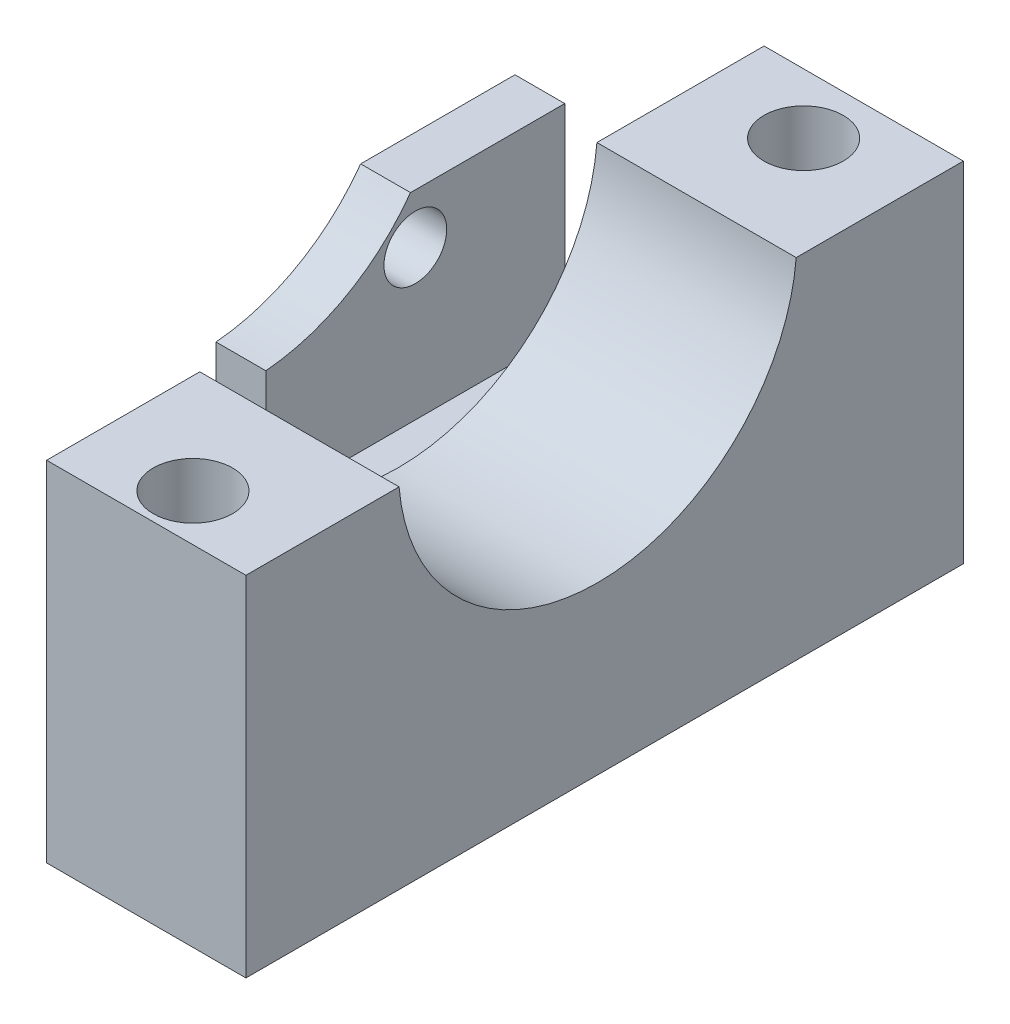
ISO-10303-21;
HEADER;
FILE_DESCRIPTION(('STEP AP214'),'2;1');
FILE_NAME('part.step','',(''),(''),'','','');
FILE_SCHEMA(('AUTOMOTIVE_DESIGN { 1 0 10303 214 1 1 1 1 }'));
ENDSEC;
DATA;
#1=APPLICATION_CONTEXT('core data for automotive mechanical design processes');
#2=APPLICATION_PROTOCOL_DEFINITION('international standard','automotive_design',2000,#1);
#3=PRODUCT_CONTEXT('',#1,'mechanical');
#4=PRODUCT('Part','Part','',(#3));
#5=PRODUCT_RELATED_PRODUCT_CATEGORY('part','',(#4));
#6=PRODUCT_DEFINITION_FORMATION('','',#4);
#7=PRODUCT_DEFINITION_CONTEXT('part definition',#1,'design');
#8=PRODUCT_DEFINITION('design','',#6,#7);
#9=PRODUCT_DEFINITION_SHAPE('','',#8);
#10=(LENGTH_UNIT() NAMED_UNIT(*) SI_UNIT(.MILLI.,.METRE.));
#11=(NAMED_UNIT(*) PLANE_ANGLE_UNIT() SI_UNIT($,.RADIAN.));
#12=(NAMED_UNIT(*) SI_UNIT($,.STERADIAN.) SOLID_ANGLE_UNIT());
#13=UNCERTAINTY_MEASURE_WITH_UNIT(LENGTH_MEASURE(1.E-05),#10,'distance_accuracy_value','');
#14=(GEOMETRIC_REPRESENTATION_CONTEXT(3) GLOBAL_UNCERTAINTY_ASSIGNED_CONTEXT((#13)) GLOBAL_UNIT_ASSIGNED_CONTEXT((#10,
#11,#12)) REPRESENTATION_CONTEXT('',''));
#15=CARTESIAN_POINT('',(0.,0.,0.));
#16=DIRECTION('',(0.,0.,1.));
#17=DIRECTION('',(1.,0.,0.));
#18=AXIS2_PLACEMENT_3D('',#15,#16,#17);
#19=CARTESIAN_POINT('',(0.,22.225,0.));
#20=DIRECTION('',(0.,1.,0.));
#21=DIRECTION('',(0.,0.,1.));
#22=AXIS2_PLACEMENT_3D('',#19,#20,#21);
#23=PLANE('',#22);
#24=CARTESIAN_POINT('',(12.7000000000003,22.225,-8.86853154239164));
#25=DIRECTION('',(0.,1.,0.));
#26=DIRECTION('',(0.,0.,1.));
#27=AXIS2_PLACEMENT_3D('',#24,#25,#26);
#28=CIRCLE('',#27,2.52729999999999);
#29=CARTESIAN_POINT('',(12.7000000000003,22.225,-6.34123154239165));
#30=VERTEX_POINT('',#29);
#31=EDGE_CURVE('E307',#30,#30,#28,.T.);
#32=ORIENTED_EDGE('',*,*,#31,.F.);
#33=EDGE_LOOP('',(#32));
#34=FACE_BOUND('',#33,.T.);
#35=DIRECTION('',(-1.,0.,0.));
#36=VECTOR('',#35,1.);
#37=CARTESIAN_POINT('',(19.05,22.225,-2.04725689228814));
#38=LINE('',#37,#36);
#39=CARTESIAN_POINT('',(19.05,22.225,-2.04725689228814));
#40=VERTEX_POINT('',#39);
#41=CARTESIAN_POINT('',(6.35,22.225,-2.04725689228814));
#42=VERTEX_POINT('',#41);
#43=EDGE_CURVE('E11',#40,#42,#38,.T.);
#44=ORIENTED_EDGE('',*,*,#43,.F.);
#45=DIRECTION('',(0.,0.,1.));
#46=VECTOR('',#45,1.);
#47=CARTESIAN_POINT('',(19.05,22.225,-12.7));
#48=LINE('',#47,#46);
#49=CARTESIAN_POINT('',(19.05,22.225,-12.7));
#50=VERTEX_POINT('',#49);
#51=EDGE_CURVE('E148',#50,#40,#48,.T.);
#52=ORIENTED_EDGE('',*,*,#51,.F.);
#53=DIRECTION('',(1.,0.,0.));
#54=VECTOR('',#53,1.);
#55=CARTESIAN_POINT('',(6.35,22.225,-12.7));
#56=LINE('',#55,#54);
#57=CARTESIAN_POINT('',(6.35,22.225,-12.7));
#58=VERTEX_POINT('',#57);
#59=EDGE_CURVE('E163',#58,#50,#56,.T.);
#60=ORIENTED_EDGE('',*,*,#59,.F.);
#61=DIRECTION('',(0.,0.,-1.));
#62=VECTOR('',#61,1.);
#63=CARTESIAN_POINT('',(6.35,22.225,-12.7));
#64=LINE('',#63,#62);
#65=EDGE_CURVE('E150',#42,#58,#64,.T.);
#66=ORIENTED_EDGE('',*,*,#65,.F.);
#67=EDGE_LOOP('',(#44,#52,#60,#66));
#68=FACE_BOUND('',#67,.T.);
#69=ADVANCED_FACE('F41',(#34,#68),#23,.T.);
#70=CARTESIAN_POINT('',(0.,3.175,9.525));
#71=DIRECTION('',(0.,0.,-1.));
#72=DIRECTION('',(-1.,0.,0.));
#73=AXIS2_PLACEMENT_3D('',#70,#71,#72);
#74=PLANE('',#73);
#75=DIRECTION('',(0.,-1.,0.));
#76=VECTOR('',#75,1.);
#77=CARTESIAN_POINT('',(-3.175,15.875,9.525));
#78=LINE('',#77,#76);
#79=CARTESIAN_POINT('',(-3.175,10.6527431077119,9.525));
#80=VERTEX_POINT('',#79);
#81=CARTESIAN_POINT('',(-3.175,3.175,9.525));
#82=VERTEX_POINT('',#81);
#83=EDGE_CURVE('E219',#80,#82,#78,.T.);
#84=ORIENTED_EDGE('',*,*,#83,.F.);
#85=DIRECTION('',(-1.,0.,0.));
#86=VECTOR('',#85,1.);
#87=CARTESIAN_POINT('',(19.05,10.6527431077119,9.525));
#88=LINE('',#87,#86);
#89=CARTESIAN_POINT('',(-6.35,10.6527431077119,9.525));
#90=VERTEX_POINT('',#89);
#91=EDGE_CURVE('E286',#80,#90,#88,.T.);
#92=ORIENTED_EDGE('',*,*,#91,.T.);
#93=DIRECTION('',(0.,-1.,0.));
#94=VECTOR('',#93,1.);
#95=CARTESIAN_POINT('',(-6.35,3.175,9.525));
#96=LINE('',#95,#94);
#97=CARTESIAN_POINT('',(-6.35,0.,9.525));
#98=VERTEX_POINT('',#97);
#99=EDGE_CURVE('E237',#90,#98,#96,.T.);
#100=ORIENTED_EDGE('',*,*,#99,.T.);
#101=DIRECTION('',(1.,0.,0.));
#102=VECTOR('',#101,1.);
#103=CARTESIAN_POINT('',(0.,0.,9.525));
#104=LINE('',#103,#102);
#105=CARTESIAN_POINT('',(6.35,0.,9.525));
#106=VERTEX_POINT('',#105);
#107=EDGE_CURVE('E222',#98,#106,#104,.T.);
#108=ORIENTED_EDGE('',*,*,#107,.T.);
#109=DIRECTION('',(0.,-1.,0.));
#110=VECTOR('',#109,1.);
#111=CARTESIAN_POINT('',(6.35,3.175,9.525));
#112=LINE('',#111,#110);
#113=CARTESIAN_POINT('',(6.35,3.175,9.525));
#114=VERTEX_POINT('',#113);
#115=EDGE_CURVE('E255',#114,#106,#112,.T.);
#116=ORIENTED_EDGE('',*,*,#115,.F.);
#117=DIRECTION('',(1.,0.,0.));
#118=VECTOR('',#117,1.);
#119=CARTESIAN_POINT('',(0.,3.175,9.525));
#120=LINE('',#119,#118);
#121=EDGE_CURVE('E226',#82,#114,#120,.T.);
#122=ORIENTED_EDGE('',*,*,#121,.F.);
#123=EDGE_LOOP('',(#84,#92,#100,#108,#116,#122));
#124=FACE_BOUND('',#123,.T.);
#125=ADVANCED_FACE('F43',(#124),#74,.F.);
#126=CARTESIAN_POINT('',(0.,3.175,-9.525));
#127=DIRECTION('',(0.,0.,-1.));
#128=DIRECTION('',(-1.,0.,0.));
#129=AXIS2_PLACEMENT_3D('',#126,#127,#128);
#130=PLANE('',#129);
#131=DIRECTION('',(1.,0.,0.));
#132=VECTOR('',#131,1.);
#133=CARTESIAN_POINT('',(0.,0.,-9.525));
#134=LINE('',#133,#132);
#135=CARTESIAN_POINT('',(-6.35,0.,-9.525));
#136=VERTEX_POINT('',#135);
#137=CARTESIAN_POINT('',(6.35,0.,-9.525));
#138=VERTEX_POINT('',#137);
#139=EDGE_CURVE('E240',#136,#138,#134,.T.);
#140=ORIENTED_EDGE('',*,*,#139,.F.);
#141=DIRECTION('',(0.,-1.,0.));
#142=VECTOR('',#141,1.);
#143=CARTESIAN_POINT('',(-6.35,3.175,-9.525));
#144=LINE('',#143,#142);
#145=CARTESIAN_POINT('',(-6.35,15.875,-9.525));
#146=VERTEX_POINT('',#145);
#147=EDGE_CURVE('E249',#146,#136,#144,.T.);
#148=ORIENTED_EDGE('',*,*,#147,.F.);
#149=DIRECTION('',(-1.,0.,0.));
#150=VECTOR('',#149,1.);
#151=CARTESIAN_POINT('',(0.,15.875,-9.525));
#152=LINE('',#151,#150);
#153=CARTESIAN_POINT('',(-3.175,15.875,-9.525));
#154=VERTEX_POINT('',#153);
#155=EDGE_CURVE('E208',#154,#146,#152,.T.);
#156=ORIENTED_EDGE('',*,*,#155,.F.);
#157=DIRECTION('',(0.,-1.,0.));
#158=VECTOR('',#157,1.);
#159=CARTESIAN_POINT('',(-3.175,15.875,-9.525));
#160=LINE('',#159,#158);
#161=CARTESIAN_POINT('',(-3.175,3.175,-9.525));
#162=VERTEX_POINT('',#161);
#163=EDGE_CURVE('E215',#154,#162,#160,.T.);
#164=ORIENTED_EDGE('',*,*,#163,.T.);
#165=DIRECTION('',(1.,0.,0.));
#166=VECTOR('',#165,1.);
#167=CARTESIAN_POINT('',(0.,3.175,-9.525));
#168=LINE('',#167,#166);
#169=CARTESIAN_POINT('',(6.35,3.175,-9.525));
#170=VERTEX_POINT('',#169);
#171=EDGE_CURVE('E234',#162,#170,#168,.T.);
#172=ORIENTED_EDGE('',*,*,#171,.T.);
#173=DIRECTION('',(0.,-1.,0.));
#174=VECTOR('',#173,1.);
#175=CARTESIAN_POINT('',(6.35,3.175,-9.525));
#176=LINE('',#175,#174);
#177=EDGE_CURVE('E252',#170,#138,#176,.T.);
#178=ORIENTED_EDGE('',*,*,#177,.T.);
#179=EDGE_LOOP('',(#140,#148,#156,#164,#172,#178));
#180=FACE_BOUND('',#179,.T.);
#181=ADVANCED_FACE('F336',(#180),#130,.T.);
#182=CARTESIAN_POINT('',(-6.35,3.175,0.));
#183=DIRECTION('',(-1.,0.,0.));
#184=DIRECTION('',(0.,0.,1.));
#185=AXIS2_PLACEMENT_3D('',#182,#183,#184);
#186=PLANE('',#185);
#187=CARTESIAN_POINT('',(-6.35,23.3066017177982,10.6066017177982));
#188=DIRECTION('',(-1.,0.,0.));
#189=DIRECTION('',(0.,0.,1.));
#190=AXIS2_PLACEMENT_3D('',#187,#188,#189);
#191=CIRCLE('',#190,12.7);
#192=CARTESIAN_POINT('',(-6.35,15.875,0.307995214585315));
#193=VERTEX_POINT('',#192);
#194=EDGE_CURVE('E142',#193,#90,#191,.T.);
#195=ORIENTED_EDGE('',*,*,#194,.F.);
#196=DIRECTION('',(0.,0.,1.));
#197=VECTOR('',#196,1.);
#198=CARTESIAN_POINT('',(-6.35,15.875,0.));
#199=LINE('',#198,#197);
#200=EDGE_CURVE('E204',#146,#193,#199,.T.);
#201=ORIENTED_EDGE('',*,*,#200,.F.);
#202=ORIENTED_EDGE('',*,*,#147,.T.);
#203=DIRECTION('',(0.,0.,-1.));
#204=VECTOR('',#203,1.);
#205=CARTESIAN_POINT('',(-6.35,0.,0.));
#206=LINE('',#205,#204);
#207=EDGE_CURVE('E230',#98,#136,#206,.T.);
#208=ORIENTED_EDGE('',*,*,#207,.F.);
#209=ORIENTED_EDGE('',*,*,#99,.F.);
#210=EDGE_LOOP('',(#195,#201,#202,#208,#209));
#211=FACE_BOUND('',#210,.T.);
#212=CARTESIAN_POINT('',(-6.35,12.7,0.));
#213=DIRECTION('',(1.,0.,0.));
#214=DIRECTION('',(0.,0.,-1.));
#215=AXIS2_PLACEMENT_3D('',#212,#213,#214);
#216=CIRCLE('',#215,2.);
#217=CARTESIAN_POINT('',(-6.35,12.7,-2.));
#218=VERTEX_POINT('',#217);
#219=EDGE_CURVE('E196',#218,#218,#216,.T.);
#220=ORIENTED_EDGE('',*,*,#219,.T.);
#221=EDGE_LOOP('',(#220));
#222=FACE_BOUND('',#221,.T.);
#223=ADVANCED_FACE('F362',(#211,#222),#186,.T.);
#224=CARTESIAN_POINT('',(0.,3.175,0.));
#225=DIRECTION('',(0.,1.,0.));
#226=DIRECTION('',(0.,0.,1.));
#227=AXIS2_PLACEMENT_3D('',#224,#225,#226);
#228=PLANE('',#227);
#229=DIRECTION('',(0.,0.,-1.));
#230=VECTOR('',#229,1.);
#231=CARTESIAN_POINT('',(-3.175,3.175,0.));
#232=LINE('',#231,#230);
#233=EDGE_CURVE('E200',#82,#162,#232,.T.);
#234=ORIENTED_EDGE('',*,*,#233,.F.);
#235=ORIENTED_EDGE('',*,*,#121,.T.);
#236=DIRECTION('',(0.,0.,-1.));
#237=VECTOR('',#236,1.);
#238=CARTESIAN_POINT('',(6.35,3.175,0.));
#239=LINE('',#238,#237);
#240=EDGE_CURVE('E229',#114,#170,#239,.T.);
#241=ORIENTED_EDGE('',*,*,#240,.T.);
#242=ORIENTED_EDGE('',*,*,#171,.F.);
#243=EDGE_LOOP('',(#234,#235,#241,#242));
#244=FACE_BOUND('',#243,.T.);
#245=ADVANCED_FACE('F352',(#244),#228,.T.);
#246=CARTESIAN_POINT('',(0.,0.,0.));
#247=DIRECTION('',(0.,1.,0.));
#248=DIRECTION('',(0.,0.,1.));
#249=AXIS2_PLACEMENT_3D('',#246,#247,#248);
#250=PLANE('',#249);
#251=CARTESIAN_POINT('',(12.7000000000003,0.,-8.86853154239164));
#252=DIRECTION('',(0.,1.,0.));
#253=DIRECTION('',(0.,0.,1.));
#254=AXIS2_PLACEMENT_3D('',#251,#252,#253);
#255=CIRCLE('',#254,2.52729999999999);
#256=CARTESIAN_POINT('',(12.7000000000003,0.,-6.34123154239165));
#257=VERTEX_POINT('',#256);
#258=EDGE_CURVE('E45',#257,#257,#255,.T.);
#259=ORIENTED_EDGE('',*,*,#258,.T.);
#260=EDGE_LOOP('',(#259));
#261=FACE_BOUND('',#260,.T.);
#262=CARTESIAN_POINT('',(12.7000000000001,0.,30.0473022088755));
#263=DIRECTION('',(0.,1.,0.));
#264=DIRECTION('',(0.,0.,1.));
#265=AXIS2_PLACEMENT_3D('',#262,#263,#264);
#266=CIRCLE('',#265,2.52729999999999);
#267=CARTESIAN_POINT('',(12.7000000000001,0.,32.5746022088755));
#268=VERTEX_POINT('',#267);
#269=EDGE_CURVE('E298',#268,#268,#266,.T.);
#270=ORIENTED_EDGE('',*,*,#269,.T.);
#271=EDGE_LOOP('',(#270));
#272=FACE_BOUND('',#271,.T.);
#273=ORIENTED_EDGE('',*,*,#107,.F.);
#274=ORIENTED_EDGE('',*,*,#207,.T.);
#275=ORIENTED_EDGE('',*,*,#139,.T.);
#276=DIRECTION('',(0.,0.,-1.));
#277=VECTOR('',#276,1.);
#278=CARTESIAN_POINT('',(6.35,0.,-12.7));
#279=LINE('',#278,#277);
#280=CARTESIAN_POINT('',(6.35,0.,-12.7));
#281=VERTEX_POINT('',#280);
#282=EDGE_CURVE('E172',#138,#281,#279,.T.);
#283=ORIENTED_EDGE('',*,*,#282,.T.);
#284=DIRECTION('',(1.,0.,0.));
#285=VECTOR('',#284,1.);
#286=CARTESIAN_POINT('',(6.35,0.,-12.7));
#287=LINE('',#286,#285);
#288=CARTESIAN_POINT('',(19.05,0.,-12.7));
#289=VERTEX_POINT('',#288);
#290=EDGE_CURVE('E171',#281,#289,#287,.T.);
#291=ORIENTED_EDGE('',*,*,#290,.T.);
#292=DIRECTION('',(0.,0.,1.));
#293=VECTOR('',#292,1.);
#294=CARTESIAN_POINT('',(19.05,0.,-12.7));
#295=LINE('',#294,#293);
#296=CARTESIAN_POINT('',(19.05,0.,33.02));
#297=VERTEX_POINT('',#296);
#298=EDGE_CURVE('E176',#289,#297,#295,.T.);
#299=ORIENTED_EDGE('',*,*,#298,.T.);
#300=DIRECTION('',(-1.,0.,0.));
#301=VECTOR('',#300,1.);
#302=CARTESIAN_POINT('',(6.35,0.,33.02));
#303=LINE('',#302,#301);
#304=CARTESIAN_POINT('',(6.35,0.,33.02));
#305=VERTEX_POINT('',#304);
#306=EDGE_CURVE('E180',#297,#305,#303,.T.);
#307=ORIENTED_EDGE('',*,*,#306,.T.);
#308=EDGE_CURVE('E167',#305,#106,#279,.T.);
#309=ORIENTED_EDGE('',*,*,#308,.T.);
#310=EDGE_LOOP('',(#273,#274,#275,#283,#291,#299,#307,#309));
#311=FACE_BOUND('',#310,.T.);
#312=ADVANCED_FACE('F270',(#261,#272,#311),#250,.F.);
#313=CARTESIAN_POINT('',(-3.175,15.875,0.));
#314=DIRECTION('',(-1.,0.,0.));
#315=DIRECTION('',(0.,0.,1.));
#316=AXIS2_PLACEMENT_3D('',#313,#314,#315);
#317=PLANE('',#316);
#318=CARTESIAN_POINT('',(-3.175,12.7,0.));
#319=DIRECTION('',(1.,0.,0.));
#320=DIRECTION('',(0.,0.,-1.));
#321=AXIS2_PLACEMENT_3D('',#318,#319,#320);
#322=CIRCLE('',#321,2.);
#323=CARTESIAN_POINT('',(-3.175,12.7,-2.));
#324=VERTEX_POINT('',#323);
#325=EDGE_CURVE('E187',#324,#324,#322,.T.);
#326=ORIENTED_EDGE('',*,*,#325,.F.);
#327=EDGE_LOOP('',(#326));
#328=FACE_BOUND('',#327,.T.);
#329=DIRECTION('',(0.,0.,-1.));
#330=VECTOR('',#329,1.);
#331=CARTESIAN_POINT('',(-3.175,15.875,0.));
#332=LINE('',#331,#330);
#333=CARTESIAN_POINT('',(-3.175,15.875,0.307995214585315));
#334=VERTEX_POINT('',#333);
#335=EDGE_CURVE('E212',#334,#154,#332,.T.);
#336=ORIENTED_EDGE('',*,*,#335,.F.);
#337=CARTESIAN_POINT('',(-3.175,23.3066017177982,10.6066017177982));
#338=DIRECTION('',(-1.,0.,0.));
#339=DIRECTION('',(0.,0.,1.));
#340=AXIS2_PLACEMENT_3D('',#337,#338,#339);
#341=CIRCLE('',#340,12.7);
#342=EDGE_CURVE('E58',#334,#80,#341,.T.);
#343=ORIENTED_EDGE('',*,*,#342,.T.);
#344=ORIENTED_EDGE('',*,*,#83,.T.);
#345=ORIENTED_EDGE('',*,*,#233,.T.);
#346=ORIENTED_EDGE('',*,*,#163,.F.);
#347=EDGE_LOOP('',(#336,#343,#344,#345,#346));
#348=FACE_BOUND('',#347,.T.);
#349=ADVANCED_FACE('F351',(#328,#348),#317,.F.);
#350=CARTESIAN_POINT('',(0.,15.875,0.));
#351=DIRECTION('',(0.,1.,0.));
#352=DIRECTION('',(0.,0.,1.));
#353=AXIS2_PLACEMENT_3D('',#350,#351,#352);
#354=PLANE('',#353);
#355=DIRECTION('',(-1.,0.,0.));
#356=VECTOR('',#355,1.);
#357=CARTESIAN_POINT('',(19.05,15.875,0.307995214585315));
#358=LINE('',#357,#356);
#359=EDGE_CURVE('E292',#334,#193,#358,.T.);
#360=ORIENTED_EDGE('',*,*,#359,.F.);
#361=ORIENTED_EDGE('',*,*,#335,.T.);
#362=ORIENTED_EDGE('',*,*,#155,.T.);
#363=ORIENTED_EDGE('',*,*,#200,.T.);
#364=EDGE_LOOP('',(#360,#361,#362,#363));
#365=FACE_BOUND('',#364,.T.);
#366=ADVANCED_FACE('F358',(#365),#354,.T.);
#367=CARTESIAN_POINT('',(-6.35,12.7,0.));
#368=DIRECTION('',(1.,0.,0.));
#369=DIRECTION('',(0.,0.,-1.));
#370=AXIS2_PLACEMENT_3D('',#367,#368,#369);
#371=CYLINDRICAL_SURFACE('',#370,2.);
#372=ORIENTED_EDGE('',*,*,#219,.F.);
#373=EDGE_LOOP('',(#372));
#374=FACE_BOUND('',#373,.T.);
#375=ORIENTED_EDGE('',*,*,#325,.T.);
#376=EDGE_LOOP('',(#375));
#377=FACE_BOUND('',#376,.T.);
#378=ADVANCED_FACE('F438',(#374,#377),#371,.F.);
#379=CARTESIAN_POINT('',(6.35,22.225,-12.7));
#380=DIRECTION('',(-1.,0.,0.));
#381=DIRECTION('',(0.,0.,1.));
#382=AXIS2_PLACEMENT_3D('',#379,#380,#381);
#383=PLANE('',#382);
#384=CARTESIAN_POINT('',(6.35,23.3066017177982,10.6066017177982));
#385=DIRECTION('',(-1.,0.,0.));
#386=DIRECTION('',(0.,0.,1.));
#387=AXIS2_PLACEMENT_3D('',#384,#385,#386);
#388=CIRCLE('',#387,12.7);
#389=CARTESIAN_POINT('',(6.35,22.225,23.2604603278845));
#390=VERTEX_POINT('',#389);
#391=EDGE_CURVE('E65',#42,#390,#388,.T.);
#392=ORIENTED_EDGE('',*,*,#391,.F.);
#393=ORIENTED_EDGE('',*,*,#65,.T.);
#394=DIRECTION('',(0.,-1.,0.));
#395=VECTOR('',#394,1.);
#396=CARTESIAN_POINT('',(6.35,22.225,-12.7));
#397=LINE('',#396,#395);
#398=EDGE_CURVE('E161',#58,#281,#397,.T.);
#399=ORIENTED_EDGE('',*,*,#398,.T.);
#400=ORIENTED_EDGE('',*,*,#282,.F.);
#401=ORIENTED_EDGE('',*,*,#177,.F.);
#402=ORIENTED_EDGE('',*,*,#240,.F.);
#403=ORIENTED_EDGE('',*,*,#115,.T.);
#404=ORIENTED_EDGE('',*,*,#308,.F.);
#405=DIRECTION('',(0.,-1.,0.));
#406=VECTOR('',#405,1.);
#407=CARTESIAN_POINT('',(6.35,22.225,33.02));
#408=LINE('',#407,#406);
#409=CARTESIAN_POINT('',(6.35,22.225,33.02));
#410=VERTEX_POINT('',#409);
#411=EDGE_CURVE('E184',#410,#305,#408,.T.);
#412=ORIENTED_EDGE('',*,*,#411,.F.);
#413=EDGE_CURVE('E279',#410,#390,#64,.T.);
#414=ORIENTED_EDGE('',*,*,#413,.T.);
#415=EDGE_LOOP('',(#392,#393,#399,#400,#401,#402,#403,#404,#412,#414));
#416=FACE_BOUND('',#415,.T.);
#417=ADVANCED_FACE('F264',(#416),#383,.T.);
#418=CARTESIAN_POINT('',(6.35,22.225,33.02));
#419=DIRECTION('',(0.,0.,1.));
#420=DIRECTION('',(1.,0.,0.));
#421=AXIS2_PLACEMENT_3D('',#418,#419,#420);
#422=PLANE('',#421);
#423=ORIENTED_EDGE('',*,*,#306,.F.);
#424=DIRECTION('',(0.,-1.,0.));
#425=VECTOR('',#424,1.);
#426=CARTESIAN_POINT('',(19.05,22.225,33.02));
#427=LINE('',#426,#425);
#428=CARTESIAN_POINT('',(19.05,22.225,33.02));
#429=VERTEX_POINT('',#428);
#430=EDGE_CURVE('E188',#429,#297,#427,.T.);
#431=ORIENTED_EDGE('',*,*,#430,.F.);
#432=DIRECTION('',(-1.,0.,0.));
#433=VECTOR('',#432,1.);
#434=CARTESIAN_POINT('',(6.35,22.225,33.02));
#435=LINE('',#434,#433);
#436=EDGE_CURVE('E155',#429,#410,#435,.T.);
#437=ORIENTED_EDGE('',*,*,#436,.T.);
#438=ORIENTED_EDGE('',*,*,#411,.T.);
#439=EDGE_LOOP('',(#423,#431,#437,#438));
#440=FACE_BOUND('',#439,.T.);
#441=ADVANCED_FACE('F275',(#440),#422,.T.);
#442=CARTESIAN_POINT('',(19.05,22.225,-12.7));
#443=DIRECTION('',(1.,0.,0.));
#444=DIRECTION('',(0.,0.,-1.));
#445=AXIS2_PLACEMENT_3D('',#442,#443,#444);
#446=PLANE('',#445);
#447=CARTESIAN_POINT('',(19.05,23.3066017177982,10.6066017177982));
#448=DIRECTION('',(-1.,0.,0.));
#449=DIRECTION('',(0.,0.,1.));
#450=AXIS2_PLACEMENT_3D('',#447,#448,#449);
#451=CIRCLE('',#450,12.7);
#452=CARTESIAN_POINT('',(19.05,22.225,23.2604603278845));
#453=VERTEX_POINT('',#452);
#454=EDGE_CURVE('E135',#40,#453,#451,.T.);
#455=ORIENTED_EDGE('',*,*,#454,.T.);
#456=EDGE_CURVE('E156',#453,#429,#48,.T.);
#457=ORIENTED_EDGE('',*,*,#456,.T.);
#458=ORIENTED_EDGE('',*,*,#430,.T.);
#459=ORIENTED_EDGE('',*,*,#298,.F.);
#460=DIRECTION('',(0.,-1.,0.));
#461=VECTOR('',#460,1.);
#462=CARTESIAN_POINT('',(19.05,22.225,-12.7));
#463=LINE('',#462,#461);
#464=EDGE_CURVE('E153',#50,#289,#463,.T.);
#465=ORIENTED_EDGE('',*,*,#464,.F.);
#466=ORIENTED_EDGE('',*,*,#51,.T.);
#467=EDGE_LOOP('',(#455,#457,#458,#459,#465,#466));
#468=FACE_BOUND('',#467,.T.);
#469=ADVANCED_FACE('F151',(#468),#446,.T.);
#470=CARTESIAN_POINT('',(6.35,22.225,-12.7));
#471=DIRECTION('',(0.,0.,-1.));
#472=DIRECTION('',(-1.,0.,0.));
#473=AXIS2_PLACEMENT_3D('',#470,#471,#472);
#474=PLANE('',#473);
#475=ORIENTED_EDGE('',*,*,#290,.F.);
#476=ORIENTED_EDGE('',*,*,#398,.F.);
#477=ORIENTED_EDGE('',*,*,#59,.T.);
#478=ORIENTED_EDGE('',*,*,#464,.T.);
#479=EDGE_LOOP('',(#475,#476,#477,#478));
#480=FACE_BOUND('',#479,.T.);
#481=ADVANCED_FACE('F340',(#480),#474,.T.);
#482=CARTESIAN_POINT('',(12.7000000000001,22.225,30.0473022088755));
#483=DIRECTION('',(0.,1.,0.));
#484=DIRECTION('',(0.,0.,1.));
#485=AXIS2_PLACEMENT_3D('',#482,#483,#484);
#486=CIRCLE('',#485,2.52729999999999);
#487=CARTESIAN_POINT('',(12.7000000000001,22.225,32.5746022088755));
#488=VERTEX_POINT('',#487);
#489=EDGE_CURVE('E303',#488,#488,#486,.T.);
#490=ORIENTED_EDGE('',*,*,#489,.F.);
#491=EDGE_LOOP('',(#490));
#492=FACE_BOUND('',#491,.T.);
#493=DIRECTION('',(-1.,0.,0.));
#494=VECTOR('',#493,1.);
#495=CARTESIAN_POINT('',(19.05,22.225,23.2604603278845));
#496=LINE('',#495,#494);
#497=EDGE_CURVE('E51',#390,#453,#496,.F.);
#498=ORIENTED_EDGE('',*,*,#497,.F.);
#499=ORIENTED_EDGE('',*,*,#413,.F.);
#500=ORIENTED_EDGE('',*,*,#436,.F.);
#501=ORIENTED_EDGE('',*,*,#456,.F.);
#502=EDGE_LOOP('',(#498,#499,#500,#501));
#503=FACE_BOUND('',#502,.T.);
#504=ADVANCED_FACE('F281',(#492,#503),#23,.T.);
#505=CARTESIAN_POINT('',(19.05,23.3066017177982,10.6066017177982));
#506=DIRECTION('',(-1.,0.,0.));
#507=DIRECTION('',(0.,0.,1.));
#508=AXIS2_PLACEMENT_3D('',#505,#506,#507);
#509=CYLINDRICAL_SURFACE('',#508,12.7);
#510=ORIENTED_EDGE('',*,*,#43,.T.);
#511=ORIENTED_EDGE('',*,*,#391,.T.);
#512=ORIENTED_EDGE('',*,*,#497,.T.);
#513=ORIENTED_EDGE('',*,*,#454,.F.);
#514=EDGE_LOOP('',(#510,#511,#512,#513));
#515=FACE_BOUND('',#514,.T.);
#516=ADVANCED_FACE('F137',(#515),#509,.F.);
#517=ORIENTED_EDGE('',*,*,#342,.F.);
#518=ORIENTED_EDGE('',*,*,#359,.T.);
#519=ORIENTED_EDGE('',*,*,#194,.T.);
#520=ORIENTED_EDGE('',*,*,#91,.F.);
#521=EDGE_LOOP('',(#517,#518,#519,#520));
#522=FACE_BOUND('',#521,.T.);
#523=ADVANCED_FACE('F325',(#522),#509,.F.);
#524=CARTESIAN_POINT('',(12.7000000000001,22.225,30.0473022088755));
#525=DIRECTION('',(0.,1.,0.));
#526=DIRECTION('',(0.,0.,1.));
#527=AXIS2_PLACEMENT_3D('',#524,#525,#526);
#528=CYLINDRICAL_SURFACE('',#527,2.52729999999999);
#529=ORIENTED_EDGE('',*,*,#489,.T.);
#530=EDGE_LOOP('',(#529));
#531=FACE_BOUND('',#530,.T.);
#532=ORIENTED_EDGE('',*,*,#269,.F.);
#533=EDGE_LOOP('',(#532));
#534=FACE_BOUND('',#533,.T.);
#535=ADVANCED_FACE('F320',(#531,#534),#528,.F.);
#536=CARTESIAN_POINT('',(12.7000000000003,22.225,-8.86853154239164));
#537=DIRECTION('',(0.,1.,0.));
#538=DIRECTION('',(0.,0.,1.));
#539=AXIS2_PLACEMENT_3D('',#536,#537,#538);
#540=CYLINDRICAL_SURFACE('',#539,2.52729999999999);
#541=ORIENTED_EDGE('',*,*,#31,.T.);
#542=EDGE_LOOP('',(#541));
#543=FACE_BOUND('',#542,.T.);
#544=ORIENTED_EDGE('',*,*,#258,.F.);
#545=EDGE_LOOP('',(#544));
#546=FACE_BOUND('',#545,.T.);
#547=ADVANCED_FACE('F318',(#543,#546),#540,.F.);
#548=CLOSED_SHELL('',(#69,#125,#181,#223,#245,#312,#349,#366,#378,#417,#441,#469,#481,#504,#516,
#523,#535,#547));
#549=MANIFOLD_SOLID_BREP('B2',#548);
#550=ADVANCED_BREP_SHAPE_REPRESENTATION('',(#18,#549),#14);
#551=SHAPE_DEFINITION_REPRESENTATION(#9,#550);
ENDSEC;
END-ISO-10303-21;
